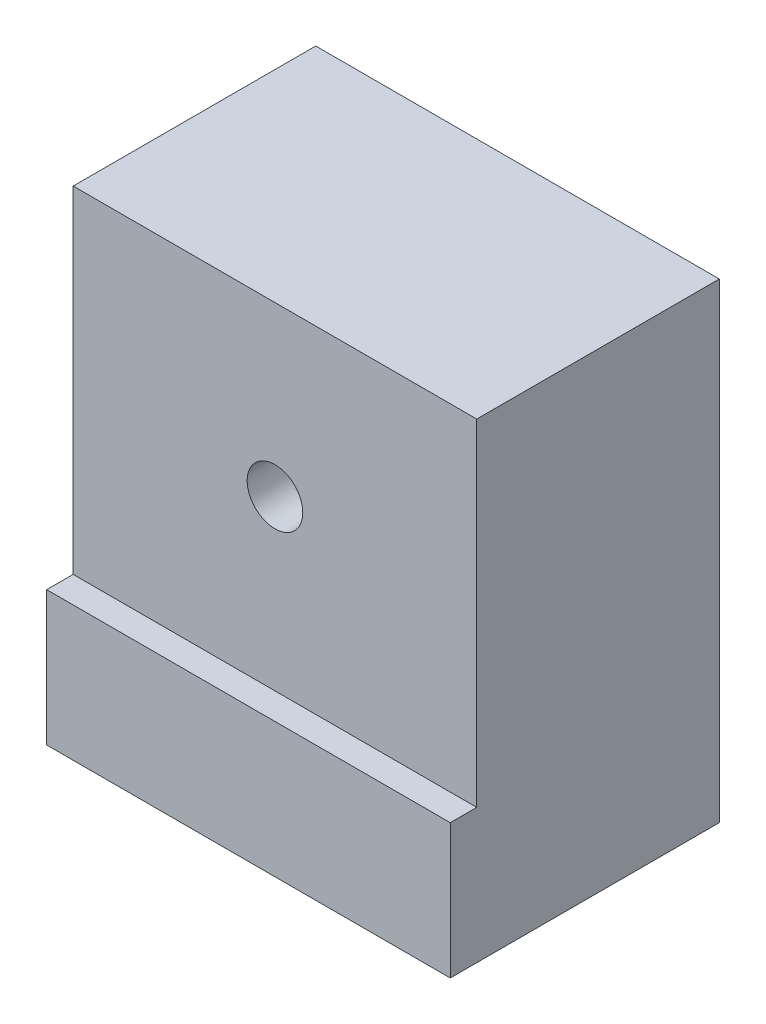
ISO-10303-21;
HEADER;
FILE_DESCRIPTION(('STEP AP214'),'2;1');
FILE_NAME('part.step','',(''),(''),'','','');
FILE_SCHEMA(('AUTOMOTIVE_DESIGN { 1 0 10303 214 1 1 1 1 }'));
ENDSEC;
DATA;
#1=APPLICATION_CONTEXT('core data for automotive mechanical design processes');
#2=APPLICATION_PROTOCOL_DEFINITION('international standard','automotive_design',2000,#1);
#3=PRODUCT_CONTEXT('',#1,'mechanical');
#4=PRODUCT('Part','Part','',(#3));
#5=PRODUCT_RELATED_PRODUCT_CATEGORY('part','',(#4));
#6=PRODUCT_DEFINITION_FORMATION('','',#4);
#7=PRODUCT_DEFINITION_CONTEXT('part definition',#1,'design');
#8=PRODUCT_DEFINITION('design','',#6,#7);
#9=PRODUCT_DEFINITION_SHAPE('','',#8);
#10=(LENGTH_UNIT() NAMED_UNIT(*) SI_UNIT(.MILLI.,.METRE.));
#11=(NAMED_UNIT(*) PLANE_ANGLE_UNIT() SI_UNIT($,.RADIAN.));
#12=(NAMED_UNIT(*) SI_UNIT($,.STERADIAN.) SOLID_ANGLE_UNIT());
#13=UNCERTAINTY_MEASURE_WITH_UNIT(LENGTH_MEASURE(1.E-05),#10,'distance_accuracy_value','');
#14=(GEOMETRIC_REPRESENTATION_CONTEXT(3) GLOBAL_UNCERTAINTY_ASSIGNED_CONTEXT((#13)) GLOBAL_UNIT_ASSIGNED_CONTEXT((#10,
#11,#12)) REPRESENTATION_CONTEXT('',''));
#15=CARTESIAN_POINT('',(0.,0.,0.));
#16=DIRECTION('',(0.,0.,1.));
#17=DIRECTION('',(1.,0.,0.));
#18=AXIS2_PLACEMENT_3D('',#15,#16,#17);
#19=CARTESIAN_POINT('',(0.,88.9,-50.8));
#20=DIRECTION('',(0.,-1.,0.));
#21=DIRECTION('',(0.,0.,-1.));
#22=AXIS2_PLACEMENT_3D('',#19,#20,#21);
#23=PLANE('',#22);
#24=DIRECTION('',(-1.,0.,0.));
#25=VECTOR('',#24,1.);
#26=CARTESIAN_POINT('',(0.,88.9,-5.));
#27=LINE('',#26,#25);
#28=CARTESIAN_POINT('',(76.2,88.9,-5.));
#29=VERTEX_POINT('',#28);
#30=CARTESIAN_POINT('',(0.,88.9,-5.));
#31=VERTEX_POINT('',#30);
#32=EDGE_CURVE('E138',#29,#31,#27,.T.);
#33=ORIENTED_EDGE('',*,*,#32,.F.);
#34=DIRECTION('',(0.,0.,-1.));
#35=VECTOR('',#34,1.);
#36=CARTESIAN_POINT('',(76.2,88.9,0.));
#37=LINE('',#36,#35);
#38=CARTESIAN_POINT('',(76.2,88.9,-50.8));
#39=VERTEX_POINT('',#38);
#40=EDGE_CURVE('E146',#29,#39,#37,.T.);
#41=ORIENTED_EDGE('',*,*,#40,.T.);
#42=DIRECTION('',(-1.,0.,0.));
#43=VECTOR('',#42,1.);
#44=CARTESIAN_POINT('',(0.,88.9,-50.8));
#45=LINE('',#44,#43);
#46=CARTESIAN_POINT('',(0.,88.9,-50.8));
#47=VERTEX_POINT('',#46);
#48=EDGE_CURVE('E57',#39,#47,#45,.T.);
#49=ORIENTED_EDGE('',*,*,#48,.T.);
#50=DIRECTION('',(0.,0.,1.));
#51=VECTOR('',#50,1.);
#52=CARTESIAN_POINT('',(0.,88.9,0.));
#53=LINE('',#52,#51);
#54=EDGE_CURVE('E85',#47,#31,#53,.T.);
#55=ORIENTED_EDGE('',*,*,#54,.T.);
#56=EDGE_LOOP('',(#33,#41,#49,#55));
#57=FACE_BOUND('',#56,.T.);
#58=ADVANCED_FACE('F31',(#57),#23,.F.);
#59=CARTESIAN_POINT('',(38.1,57.15,-300.));
#60=DIRECTION('',(0.,0.,1.));
#61=DIRECTION('',(1.,0.,0.));
#62=AXIS2_PLACEMENT_3D('',#59,#60,#61);
#63=CYLINDRICAL_SURFACE('',#62,5.25);
#64=CARTESIAN_POINT('',(38.1,57.15,-50.8));
#65=DIRECTION('',(0.,0.,1.));
#66=DIRECTION('',(1.,0.,0.));
#67=AXIS2_PLACEMENT_3D('',#64,#65,#66);
#68=CIRCLE('',#67,5.25);
#69=CARTESIAN_POINT('',(43.35,57.15,-50.8));
#70=VERTEX_POINT('',#69);
#71=EDGE_CURVE('E98',#70,#70,#68,.T.);
#72=ORIENTED_EDGE('',*,*,#71,.F.);
#73=EDGE_LOOP('',(#72));
#74=FACE_BOUND('',#73,.T.);
#75=CARTESIAN_POINT('',(38.1,57.15,-5.));
#76=DIRECTION('',(0.,0.,1.));
#77=DIRECTION('',(1.,0.,0.));
#78=AXIS2_PLACEMENT_3D('',#75,#76,#77);
#79=CIRCLE('',#78,5.25);
#80=CARTESIAN_POINT('',(43.35,57.15,-5.));
#81=VERTEX_POINT('',#80);
#82=EDGE_CURVE('E35',#81,#81,#79,.F.);
#83=ORIENTED_EDGE('',*,*,#82,.F.);
#84=EDGE_LOOP('',(#83));
#85=FACE_BOUND('',#84,.T.);
#86=ADVANCED_FACE('F149',(#74,#85),#63,.F.);
#87=CARTESIAN_POINT('',(0.,88.9,0.));
#88=DIRECTION('',(1.,0.,0.));
#89=DIRECTION('',(0.,0.,-1.));
#90=AXIS2_PLACEMENT_3D('',#87,#88,#89);
#91=PLANE('',#90);
#92=DIRECTION('',(0.,-1.,0.));
#93=VECTOR('',#92,1.);
#94=CARTESIAN_POINT('',(0.,88.9,0.));
#95=LINE('',#94,#93);
#96=CARTESIAN_POINT('',(0.,25.4,0.));
#97=VERTEX_POINT('',#96);
#98=CARTESIAN_POINT('',(0.,0.,0.));
#99=VERTEX_POINT('',#98);
#100=EDGE_CURVE('E11',#97,#99,#95,.T.);
#101=ORIENTED_EDGE('',*,*,#100,.F.);
#102=DIRECTION('',(0.,0.,1.));
#103=VECTOR('',#102,1.);
#104=CARTESIAN_POINT('',(0.,25.4,-5.));
#105=LINE('',#104,#103);
#106=CARTESIAN_POINT('',(0.,25.4,-5.));
#107=VERTEX_POINT('',#106);
#108=EDGE_CURVE('E123',#107,#97,#105,.T.);
#109=ORIENTED_EDGE('',*,*,#108,.F.);
#110=DIRECTION('',(0.,-1.,0.));
#111=VECTOR('',#110,1.);
#112=CARTESIAN_POINT('',(0.,88.9,-5.));
#113=LINE('',#112,#111);
#114=EDGE_CURVE('E134',#31,#107,#113,.T.);
#115=ORIENTED_EDGE('',*,*,#114,.F.);
#116=ORIENTED_EDGE('',*,*,#54,.F.);
#117=DIRECTION('',(0.,-1.,0.));
#118=VECTOR('',#117,1.);
#119=CARTESIAN_POINT('',(0.,88.9,-50.8));
#120=LINE('',#119,#118);
#121=CARTESIAN_POINT('',(0.,0.,-50.8));
#122=VERTEX_POINT('',#121);
#123=EDGE_CURVE('E78',#47,#122,#120,.T.);
#124=ORIENTED_EDGE('',*,*,#123,.T.);
#125=DIRECTION('',(0.,0.,1.));
#126=VECTOR('',#125,1.);
#127=CARTESIAN_POINT('',(0.,0.,0.));
#128=LINE('',#127,#126);
#129=EDGE_CURVE('E91',#122,#99,#128,.T.);
#130=ORIENTED_EDGE('',*,*,#129,.T.);
#131=EDGE_LOOP('',(#101,#109,#115,#116,#124,#130));
#132=FACE_BOUND('',#131,.T.);
#133=ADVANCED_FACE('F33',(#132),#91,.F.);
#134=CARTESIAN_POINT('',(0.,88.9,0.));
#135=DIRECTION('',(0.,0.,-1.));
#136=DIRECTION('',(-1.,0.,0.));
#137=AXIS2_PLACEMENT_3D('',#134,#135,#136);
#138=PLANE('',#137);
#139=DIRECTION('',(0.,-1.,0.));
#140=VECTOR('',#139,1.);
#141=CARTESIAN_POINT('',(76.2,88.9,0.));
#142=LINE('',#141,#140);
#143=CARTESIAN_POINT('',(76.2,25.4,0.));
#144=VERTEX_POINT('',#143);
#145=CARTESIAN_POINT('',(76.2,0.,0.));
#146=VERTEX_POINT('',#145);
#147=EDGE_CURVE('E40',#144,#146,#142,.T.);
#148=ORIENTED_EDGE('',*,*,#147,.F.);
#149=DIRECTION('',(1.,0.,0.));
#150=VECTOR('',#149,1.);
#151=CARTESIAN_POINT('',(0.,25.4,0.));
#152=LINE('',#151,#150);
#153=EDGE_CURVE('E119',#97,#144,#152,.T.);
#154=ORIENTED_EDGE('',*,*,#153,.F.);
#155=ORIENTED_EDGE('',*,*,#100,.T.);
#156=DIRECTION('',(1.,0.,0.));
#157=VECTOR('',#156,1.);
#158=CARTESIAN_POINT('',(0.,0.,0.));
#159=LINE('',#158,#157);
#160=EDGE_CURVE('E97',#99,#146,#159,.T.);
#161=ORIENTED_EDGE('',*,*,#160,.T.);
#162=EDGE_LOOP('',(#148,#154,#155,#161));
#163=FACE_BOUND('',#162,.T.);
#164=ADVANCED_FACE('F116',(#163),#138,.F.);
#165=CARTESIAN_POINT('',(76.2,88.9,0.));
#166=DIRECTION('',(-1.,0.,0.));
#167=DIRECTION('',(0.,0.,1.));
#168=AXIS2_PLACEMENT_3D('',#165,#166,#167);
#169=PLANE('',#168);
#170=DIRECTION('',(0.,1.,0.));
#171=VECTOR('',#170,1.);
#172=CARTESIAN_POINT('',(76.2,88.9,-5.));
#173=LINE('',#172,#171);
#174=CARTESIAN_POINT('',(76.2,25.4,-5.));
#175=VERTEX_POINT('',#174);
#176=EDGE_CURVE('E48',#175,#29,#173,.T.);
#177=ORIENTED_EDGE('',*,*,#176,.F.);
#178=DIRECTION('',(0.,0.,1.));
#179=VECTOR('',#178,1.);
#180=CARTESIAN_POINT('',(76.2,25.4,-5.));
#181=LINE('',#180,#179);
#182=EDGE_CURVE('E113',#175,#144,#181,.T.);
#183=ORIENTED_EDGE('',*,*,#182,.T.);
#184=ORIENTED_EDGE('',*,*,#147,.T.);
#185=DIRECTION('',(0.,0.,-1.));
#186=VECTOR('',#185,1.);
#187=CARTESIAN_POINT('',(76.2,0.,0.));
#188=LINE('',#187,#186);
#189=CARTESIAN_POINT('',(76.2,0.,-50.8));
#190=VERTEX_POINT('',#189);
#191=EDGE_CURVE('E86',#146,#190,#188,.T.);
#192=ORIENTED_EDGE('',*,*,#191,.T.);
#193=DIRECTION('',(0.,-1.,0.));
#194=VECTOR('',#193,1.);
#195=CARTESIAN_POINT('',(76.2,88.9,-50.8));
#196=LINE('',#195,#194);
#197=EDGE_CURVE('E81',#39,#190,#196,.T.);
#198=ORIENTED_EDGE('',*,*,#197,.F.);
#199=ORIENTED_EDGE('',*,*,#40,.F.);
#200=EDGE_LOOP('',(#177,#183,#184,#192,#198,#199));
#201=FACE_BOUND('',#200,.T.);
#202=ADVANCED_FACE('F110',(#201),#169,.F.);
#203=CARTESIAN_POINT('',(0.,88.9,-50.8));
#204=DIRECTION('',(0.,0.,1.));
#205=DIRECTION('',(1.,0.,0.));
#206=AXIS2_PLACEMENT_3D('',#203,#204,#205);
#207=PLANE('',#206);
#208=ORIENTED_EDGE('',*,*,#71,.T.);
#209=EDGE_LOOP('',(#208));
#210=FACE_BOUND('',#209,.T.);
#211=DIRECTION('',(-1.,0.,0.));
#212=VECTOR('',#211,1.);
#213=CARTESIAN_POINT('',(0.,0.,-50.8));
#214=LINE('',#213,#212);
#215=EDGE_CURVE('E75',#190,#122,#214,.T.);
#216=ORIENTED_EDGE('',*,*,#215,.T.);
#217=ORIENTED_EDGE('',*,*,#123,.F.);
#218=ORIENTED_EDGE('',*,*,#48,.F.);
#219=ORIENTED_EDGE('',*,*,#197,.T.);
#220=EDGE_LOOP('',(#216,#217,#218,#219));
#221=FACE_BOUND('',#220,.T.);
#222=ADVANCED_FACE('F77',(#210,#221),#207,.F.);
#223=CARTESIAN_POINT('',(0.,0.,-50.8));
#224=DIRECTION('',(0.,-1.,0.));
#225=DIRECTION('',(0.,0.,-1.));
#226=AXIS2_PLACEMENT_3D('',#223,#224,#225);
#227=PLANE('',#226);
#228=ORIENTED_EDGE('',*,*,#129,.F.);
#229=ORIENTED_EDGE('',*,*,#215,.F.);
#230=ORIENTED_EDGE('',*,*,#191,.F.);
#231=ORIENTED_EDGE('',*,*,#160,.F.);
#232=EDGE_LOOP('',(#228,#229,#230,#231));
#233=FACE_BOUND('',#232,.T.);
#234=ADVANCED_FACE('F95',(#233),#227,.T.);
#235=CARTESIAN_POINT('',(0.,25.4,-5.));
#236=DIRECTION('',(0.,0.,1.));
#237=DIRECTION('',(1.,0.,0.));
#238=AXIS2_PLACEMENT_3D('',#235,#236,#237);
#239=PLANE('',#238);
#240=ORIENTED_EDGE('',*,*,#114,.T.);
#241=DIRECTION('',(1.,0.,0.));
#242=VECTOR('',#241,1.);
#243=CARTESIAN_POINT('',(0.,25.4,-5.));
#244=LINE('',#243,#242);
#245=EDGE_CURVE('E131',#107,#175,#244,.T.);
#246=ORIENTED_EDGE('',*,*,#245,.T.);
#247=ORIENTED_EDGE('',*,*,#176,.T.);
#248=ORIENTED_EDGE('',*,*,#32,.T.);
#249=EDGE_LOOP('',(#240,#246,#247,#248));
#250=FACE_BOUND('',#249,.T.);
#251=ORIENTED_EDGE('',*,*,#82,.T.);
#252=EDGE_LOOP('',(#251));
#253=FACE_BOUND('',#252,.T.);
#254=ADVANCED_FACE('F136',(#250,#253),#239,.T.);
#255=CARTESIAN_POINT('',(0.,25.4,-5.));
#256=DIRECTION('',(0.,-1.,0.));
#257=DIRECTION('',(0.,0.,-1.));
#258=AXIS2_PLACEMENT_3D('',#255,#256,#257);
#259=PLANE('',#258);
#260=ORIENTED_EDGE('',*,*,#153,.T.);
#261=ORIENTED_EDGE('',*,*,#182,.F.);
#262=ORIENTED_EDGE('',*,*,#245,.F.);
#263=ORIENTED_EDGE('',*,*,#108,.T.);
#264=EDGE_LOOP('',(#260,#261,#262,#263));
#265=FACE_BOUND('',#264,.T.);
#266=ADVANCED_FACE('F133',(#265),#259,.F.);
#267=CLOSED_SHELL('',(#58,#86,#133,#164,#202,#222,#234,#254,#266));
#268=MANIFOLD_SOLID_BREP('B2',#267);
#269=ADVANCED_BREP_SHAPE_REPRESENTATION('',(#18,#268),#14);
#270=SHAPE_DEFINITION_REPRESENTATION(#9,#269);
ENDSEC;
END-ISO-10303-21;
